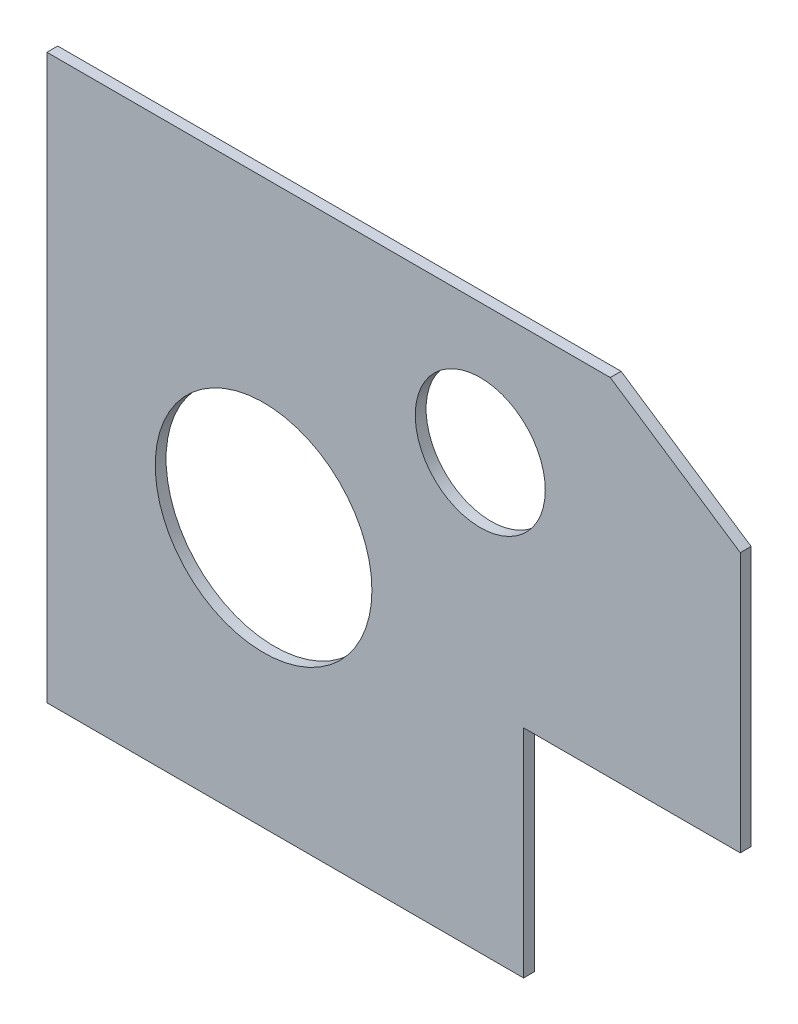
ISO-10303-21;
HEADER;
FILE_DESCRIPTION(('STEP AP214'),'2;1');
FILE_NAME('part.step','',(''),(''),'','','');
FILE_SCHEMA(('AUTOMOTIVE_DESIGN { 1 0 10303 214 1 1 1 1 }'));
ENDSEC;
DATA;
#1=APPLICATION_CONTEXT('core data for automotive mechanical design processes');
#2=APPLICATION_PROTOCOL_DEFINITION('international standard','automotive_design',2000,#1);
#3=PRODUCT_CONTEXT('',#1,'mechanical');
#4=PRODUCT('Part','Part','',(#3));
#5=PRODUCT_RELATED_PRODUCT_CATEGORY('part','',(#4));
#6=PRODUCT_DEFINITION_FORMATION('','',#4);
#7=PRODUCT_DEFINITION_CONTEXT('part definition',#1,'design');
#8=PRODUCT_DEFINITION('design','',#6,#7);
#9=PRODUCT_DEFINITION_SHAPE('','',#8);
#10=(LENGTH_UNIT() NAMED_UNIT(*) SI_UNIT(.MILLI.,.METRE.));
#11=(NAMED_UNIT(*) PLANE_ANGLE_UNIT() SI_UNIT($,.RADIAN.));
#12=(NAMED_UNIT(*) SI_UNIT($,.STERADIAN.) SOLID_ANGLE_UNIT());
#13=UNCERTAINTY_MEASURE_WITH_UNIT(LENGTH_MEASURE(1.E-05),#10,'distance_accuracy_value','');
#14=(GEOMETRIC_REPRESENTATION_CONTEXT(3) GLOBAL_UNCERTAINTY_ASSIGNED_CONTEXT((#13)) GLOBAL_UNIT_ASSIGNED_CONTEXT((#10,
#11,#12)) REPRESENTATION_CONTEXT('',''));
#15=CARTESIAN_POINT('',(0.,0.,0.));
#16=DIRECTION('',(0.,0.,1.));
#17=DIRECTION('',(1.,0.,0.));
#18=AXIS2_PLACEMENT_3D('',#15,#16,#17);
#19=CARTESIAN_POINT('',(203.2,0.,3.175));
#20=DIRECTION('',(-1.,0.,0.));
#21=DIRECTION('',(0.,0.,1.));
#22=AXIS2_PLACEMENT_3D('',#19,#20,#21);
#23=PLANE('',#22);
#24=DIRECTION('',(0.,0.,-1.));
#25=VECTOR('',#24,1.);
#26=CARTESIAN_POINT('',(203.2,139.7,334.439322230305));
#27=LINE('',#26,#25);
#28=CARTESIAN_POINT('',(203.2,139.7,3.17499999999998));
#29=VERTEX_POINT('',#28);
#30=CARTESIAN_POINT('',(203.2,139.7,0.));
#31=VERTEX_POINT('',#30);
#32=EDGE_CURVE('E48',#29,#31,#27,.T.);
#33=ORIENTED_EDGE('',*,*,#32,.F.);
#34=DIRECTION('',(0.,1.,0.));
#35=VECTOR('',#34,1.);
#36=CARTESIAN_POINT('',(203.2,0.,3.175));
#37=LINE('',#36,#35);
#38=CARTESIAN_POINT('',(203.2,63.5,3.175));
#39=VERTEX_POINT('',#38);
#40=EDGE_CURVE('E107',#39,#29,#37,.T.);
#41=ORIENTED_EDGE('',*,*,#40,.F.);
#42=DIRECTION('',(0.,0.,-1.));
#43=VECTOR('',#42,1.);
#44=CARTESIAN_POINT('',(203.2,63.5,3.176));
#45=LINE('',#44,#43);
#46=CARTESIAN_POINT('',(203.2,63.5,0.));
#47=VERTEX_POINT('',#46);
#48=EDGE_CURVE('E124',#39,#47,#45,.T.);
#49=ORIENTED_EDGE('',*,*,#48,.T.);
#50=DIRECTION('',(0.,1.,0.));
#51=VECTOR('',#50,1.);
#52=CARTESIAN_POINT('',(203.2,0.,0.));
#53=LINE('',#52,#51);
#54=EDGE_CURVE('E127',#47,#31,#53,.T.);
#55=ORIENTED_EDGE('',*,*,#54,.T.);
#56=EDGE_LOOP('',(#33,#41,#49,#55));
#57=FACE_BOUND('',#56,.T.);
#58=ADVANCED_FACE('F33',(#57),#23,.F.);
#59=CARTESIAN_POINT('',(0.,0.,3.175));
#60=DIRECTION('',(0.,0.,-1.));
#61=DIRECTION('',(-1.,0.,0.));
#62=AXIS2_PLACEMENT_3D('',#59,#60,#61);
#63=PLANE('',#62);
#64=CARTESIAN_POINT('',(127.,127.,3.175));
#65=DIRECTION('',(0.,0.,1.));
#66=DIRECTION('',(1.,0.,0.));
#67=AXIS2_PLACEMENT_3D('',#64,#65,#66);
#68=CIRCLE('',#67,19.05);
#69=CARTESIAN_POINT('',(146.05,127.,3.175));
#70=VERTEX_POINT('',#69);
#71=EDGE_CURVE('E166',#70,#70,#68,.T.);
#72=ORIENTED_EDGE('',*,*,#71,.F.);
#73=EDGE_LOOP('',(#72));
#74=FACE_BOUND('',#73,.T.);
#75=CARTESIAN_POINT('',(63.5,76.2,3.175));
#76=DIRECTION('',(0.,0.,1.));
#77=DIRECTION('',(1.,0.,0.));
#78=AXIS2_PLACEMENT_3D('',#75,#76,#77);
#79=CIRCLE('',#78,31.75);
#80=CARTESIAN_POINT('',(95.25,76.2,3.175));
#81=VERTEX_POINT('',#80);
#82=EDGE_CURVE('E160',#81,#81,#79,.T.);
#83=ORIENTED_EDGE('',*,*,#82,.F.);
#84=EDGE_LOOP('',(#83));
#85=FACE_BOUND('',#84,.T.);
#86=DIRECTION('',(0.832050294337844,-0.554700196225229,0.));
#87=VECTOR('',#86,1.);
#88=CARTESIAN_POINT('',(127.,190.5,3.175));
#89=LINE('',#88,#87);
#90=CARTESIAN_POINT('',(165.1,165.1,3.17499999999998));
#91=VERTEX_POINT('',#90);
#92=EDGE_CURVE('E93',#91,#29,#89,.T.);
#93=ORIENTED_EDGE('',*,*,#92,.F.);
#94=DIRECTION('',(-1.,0.,0.));
#95=VECTOR('',#94,1.);
#96=CARTESIAN_POINT('',(0.,165.1,3.175));
#97=LINE('',#96,#95);
#98=CARTESIAN_POINT('',(0.,165.1,3.175));
#99=VERTEX_POINT('',#98);
#100=EDGE_CURVE('E103',#91,#99,#97,.T.);
#101=ORIENTED_EDGE('',*,*,#100,.T.);
#102=DIRECTION('',(0.,-1.,0.));
#103=VECTOR('',#102,1.);
#104=CARTESIAN_POINT('',(0.,0.,3.175));
#105=LINE('',#104,#103);
#106=CARTESIAN_POINT('',(0.,0.,3.175));
#107=VERTEX_POINT('',#106);
#108=EDGE_CURVE('E131',#99,#107,#105,.T.);
#109=ORIENTED_EDGE('',*,*,#108,.T.);
#110=DIRECTION('',(1.,0.,0.));
#111=VECTOR('',#110,1.);
#112=CARTESIAN_POINT('',(0.,0.,3.175));
#113=LINE('',#112,#111);
#114=CARTESIAN_POINT('',(139.7,0.,3.175));
#115=VERTEX_POINT('',#114);
#116=EDGE_CURVE('E116',#107,#115,#113,.T.);
#117=ORIENTED_EDGE('',*,*,#116,.T.);
#118=DIRECTION('',(0.,-1.,0.));
#119=VECTOR('',#118,1.);
#120=CARTESIAN_POINT('',(139.7,0.,3.175));
#121=LINE('',#120,#119);
#122=CARTESIAN_POINT('',(139.7,63.5,3.175));
#123=VERTEX_POINT('',#122);
#124=EDGE_CURVE('E108',#123,#115,#121,.T.);
#125=ORIENTED_EDGE('',*,*,#124,.F.);
#126=DIRECTION('',(-1.,0.,0.));
#127=VECTOR('',#126,1.);
#128=CARTESIAN_POINT('',(203.2,63.5,3.175));
#129=LINE('',#128,#127);
#130=EDGE_CURVE('E145',#39,#123,#129,.T.);
#131=ORIENTED_EDGE('',*,*,#130,.F.);
#132=ORIENTED_EDGE('',*,*,#40,.T.);
#133=EDGE_LOOP('',(#93,#101,#109,#117,#125,#131,#132));
#134=FACE_BOUND('',#133,.T.);
#135=ADVANCED_FACE('F101',(#74,#85,#134),#63,.F.);
#136=CARTESIAN_POINT('',(0.,0.,0.));
#137=DIRECTION('',(0.,0.,-1.));
#138=DIRECTION('',(-1.,0.,0.));
#139=AXIS2_PLACEMENT_3D('',#136,#137,#138);
#140=PLANE('',#139);
#141=CARTESIAN_POINT('',(127.,127.,0.));
#142=DIRECTION('',(0.,0.,1.));
#143=DIRECTION('',(1.,0.,0.));
#144=AXIS2_PLACEMENT_3D('',#141,#142,#143);
#145=CIRCLE('',#144,19.05);
#146=CARTESIAN_POINT('',(146.05,127.,0.));
#147=VERTEX_POINT('',#146);
#148=EDGE_CURVE('E97',#147,#147,#145,.T.);
#149=ORIENTED_EDGE('',*,*,#148,.T.);
#150=EDGE_LOOP('',(#149));
#151=FACE_BOUND('',#150,.T.);
#152=CARTESIAN_POINT('',(63.5,76.2,0.));
#153=DIRECTION('',(0.,0.,1.));
#154=DIRECTION('',(1.,0.,0.));
#155=AXIS2_PLACEMENT_3D('',#152,#153,#154);
#156=CIRCLE('',#155,31.75);
#157=CARTESIAN_POINT('',(95.25,76.2,0.));
#158=VERTEX_POINT('',#157);
#159=EDGE_CURVE('E163',#158,#158,#156,.T.);
#160=ORIENTED_EDGE('',*,*,#159,.T.);
#161=EDGE_LOOP('',(#160));
#162=FACE_BOUND('',#161,.T.);
#163=DIRECTION('',(-1.,0.,0.));
#164=VECTOR('',#163,1.);
#165=CARTESIAN_POINT('',(0.,165.1,0.));
#166=LINE('',#165,#164);
#167=CARTESIAN_POINT('',(165.1,165.1,0.));
#168=VERTEX_POINT('',#167);
#169=CARTESIAN_POINT('',(0.,165.1,0.));
#170=VERTEX_POINT('',#169);
#171=EDGE_CURVE('E130',#168,#170,#166,.T.);
#172=ORIENTED_EDGE('',*,*,#171,.F.);
#173=DIRECTION('',(0.832050294337844,-0.554700196225229,0.));
#174=VECTOR('',#173,1.);
#175=CARTESIAN_POINT('',(127.,190.5,0.));
#176=LINE('',#175,#174);
#177=EDGE_CURVE('E11',#168,#31,#176,.T.);
#178=ORIENTED_EDGE('',*,*,#177,.T.);
#179=ORIENTED_EDGE('',*,*,#54,.F.);
#180=DIRECTION('',(1.,0.,0.));
#181=VECTOR('',#180,1.);
#182=CARTESIAN_POINT('',(203.2,63.5,0.));
#183=LINE('',#182,#181);
#184=CARTESIAN_POINT('',(139.7,63.5,0.));
#185=VERTEX_POINT('',#184);
#186=EDGE_CURVE('E144',#185,#47,#183,.T.);
#187=ORIENTED_EDGE('',*,*,#186,.F.);
#188=DIRECTION('',(0.,1.,0.));
#189=VECTOR('',#188,1.);
#190=CARTESIAN_POINT('',(139.7,0.,0.));
#191=LINE('',#190,#189);
#192=CARTESIAN_POINT('',(139.7,0.,0.));
#193=VERTEX_POINT('',#192);
#194=EDGE_CURVE('E142',#193,#185,#191,.T.);
#195=ORIENTED_EDGE('',*,*,#194,.F.);
#196=DIRECTION('',(1.,0.,0.));
#197=VECTOR('',#196,1.);
#198=CARTESIAN_POINT('',(0.,0.,0.));
#199=LINE('',#198,#197);
#200=CARTESIAN_POINT('',(0.,0.,0.));
#201=VERTEX_POINT('',#200);
#202=EDGE_CURVE('E123',#201,#193,#199,.T.);
#203=ORIENTED_EDGE('',*,*,#202,.F.);
#204=DIRECTION('',(0.,-1.,0.));
#205=VECTOR('',#204,1.);
#206=CARTESIAN_POINT('',(0.,0.,0.));
#207=LINE('',#206,#205);
#208=EDGE_CURVE('E120',#170,#201,#207,.T.);
#209=ORIENTED_EDGE('',*,*,#208,.F.);
#210=EDGE_LOOP('',(#172,#178,#179,#187,#195,#203,#209));
#211=FACE_BOUND('',#210,.T.);
#212=ADVANCED_FACE('F140',(#151,#162,#211),#140,.T.);
#213=CARTESIAN_POINT('',(0.,0.,3.175));
#214=DIRECTION('',(1.,0.,0.));
#215=DIRECTION('',(0.,0.,-1.));
#216=AXIS2_PLACEMENT_3D('',#213,#214,#215);
#217=PLANE('',#216);
#218=ORIENTED_EDGE('',*,*,#208,.T.);
#219=DIRECTION('',(0.,0.,-1.));
#220=VECTOR('',#219,1.);
#221=CARTESIAN_POINT('',(0.,0.,3.175));
#222=LINE('',#221,#220);
#223=EDGE_CURVE('E41',#107,#201,#222,.T.);
#224=ORIENTED_EDGE('',*,*,#223,.F.);
#225=ORIENTED_EDGE('',*,*,#108,.F.);
#226=DIRECTION('',(0.,0.,-1.));
#227=VECTOR('',#226,1.);
#228=CARTESIAN_POINT('',(0.,165.1,3.175));
#229=LINE('',#228,#227);
#230=EDGE_CURVE('E112',#99,#170,#229,.T.);
#231=ORIENTED_EDGE('',*,*,#230,.T.);
#232=EDGE_LOOP('',(#218,#224,#225,#231));
#233=FACE_BOUND('',#232,.T.);
#234=ADVANCED_FACE('F35',(#233),#217,.F.);
#235=CARTESIAN_POINT('',(0.,0.,3.175));
#236=DIRECTION('',(0.,1.,0.));
#237=DIRECTION('',(0.,0.,1.));
#238=AXIS2_PLACEMENT_3D('',#235,#236,#237);
#239=PLANE('',#238);
#240=ORIENTED_EDGE('',*,*,#202,.T.);
#241=DIRECTION('',(0.,0.,-1.));
#242=VECTOR('',#241,1.);
#243=CARTESIAN_POINT('',(139.7,0.,3.176));
#244=LINE('',#243,#242);
#245=EDGE_CURVE('E55',#115,#193,#244,.T.);
#246=ORIENTED_EDGE('',*,*,#245,.F.);
#247=ORIENTED_EDGE('',*,*,#116,.F.);
#248=ORIENTED_EDGE('',*,*,#223,.T.);
#249=EDGE_LOOP('',(#240,#246,#247,#248));
#250=FACE_BOUND('',#249,.T.);
#251=ADVANCED_FACE('F135',(#250),#239,.F.);
#252=CARTESIAN_POINT('',(0.,165.1,3.175));
#253=DIRECTION('',(0.,-1.,0.));
#254=DIRECTION('',(0.,0.,-1.));
#255=AXIS2_PLACEMENT_3D('',#252,#253,#254);
#256=PLANE('',#255);
#257=ORIENTED_EDGE('',*,*,#100,.F.);
#258=DIRECTION('',(0.,0.,-1.));
#259=VECTOR('',#258,1.);
#260=CARTESIAN_POINT('',(165.1,165.1,334.439322230305));
#261=LINE('',#260,#259);
#262=EDGE_CURVE('E90',#91,#168,#261,.T.);
#263=ORIENTED_EDGE('',*,*,#262,.T.);
#264=ORIENTED_EDGE('',*,*,#171,.T.);
#265=ORIENTED_EDGE('',*,*,#230,.F.);
#266=EDGE_LOOP('',(#257,#263,#264,#265));
#267=FACE_BOUND('',#266,.T.);
#268=ADVANCED_FACE('F110',(#267),#256,.F.);
#269=CARTESIAN_POINT('',(203.2,63.5,3.176));
#270=DIRECTION('',(0.,1.,0.));
#271=DIRECTION('',(0.,0.,1.));
#272=AXIS2_PLACEMENT_3D('',#269,#270,#271);
#273=PLANE('',#272);
#274=ORIENTED_EDGE('',*,*,#130,.T.);
#275=DIRECTION('',(0.,0.,-1.));
#276=VECTOR('',#275,1.);
#277=CARTESIAN_POINT('',(139.7,63.5,3.176));
#278=LINE('',#277,#276);
#279=EDGE_CURVE('E154',#123,#185,#278,.T.);
#280=ORIENTED_EDGE('',*,*,#279,.T.);
#281=ORIENTED_EDGE('',*,*,#186,.T.);
#282=ORIENTED_EDGE('',*,*,#48,.F.);
#283=EDGE_LOOP('',(#274,#280,#281,#282));
#284=FACE_BOUND('',#283,.T.);
#285=ADVANCED_FACE('F207',(#284),#273,.F.);
#286=CARTESIAN_POINT('',(139.7,0.,3.176));
#287=DIRECTION('',(-1.,0.,0.));
#288=DIRECTION('',(0.,0.,1.));
#289=AXIS2_PLACEMENT_3D('',#286,#287,#288);
#290=PLANE('',#289);
#291=ORIENTED_EDGE('',*,*,#124,.T.);
#292=ORIENTED_EDGE('',*,*,#245,.T.);
#293=ORIENTED_EDGE('',*,*,#194,.T.);
#294=ORIENTED_EDGE('',*,*,#279,.F.);
#295=EDGE_LOOP('',(#291,#292,#293,#294));
#296=FACE_BOUND('',#295,.T.);
#297=ADVANCED_FACE('F192',(#296),#290,.F.);
#298=CARTESIAN_POINT('',(165.1,165.1,334.439322230305));
#299=DIRECTION('',(0.554700196225229,0.832050294337844,0.));
#300=DIRECTION('',(-0.832050294337844,0.554700196225229,0.));
#301=AXIS2_PLACEMENT_3D('',#298,#299,#300);
#302=PLANE('',#301);
#303=ORIENTED_EDGE('',*,*,#262,.F.);
#304=ORIENTED_EDGE('',*,*,#92,.T.);
#305=ORIENTED_EDGE('',*,*,#32,.T.);
#306=ORIENTED_EDGE('',*,*,#177,.F.);
#307=EDGE_LOOP('',(#303,#304,#305,#306));
#308=FACE_BOUND('',#307,.T.);
#309=ADVANCED_FACE('F92',(#308),#302,.T.);
#310=CARTESIAN_POINT('',(63.5,76.2,0.));
#311=DIRECTION('',(0.,0.,1.));
#312=DIRECTION('',(1.,0.,0.));
#313=AXIS2_PLACEMENT_3D('',#310,#311,#312);
#314=CYLINDRICAL_SURFACE('',#313,31.75);
#315=ORIENTED_EDGE('',*,*,#159,.F.);
#316=EDGE_LOOP('',(#315));
#317=FACE_BOUND('',#316,.T.);
#318=ORIENTED_EDGE('',*,*,#82,.T.);
#319=EDGE_LOOP('',(#318));
#320=FACE_BOUND('',#319,.T.);
#321=ADVANCED_FACE('F177',(#317,#320),#314,.F.);
#322=CARTESIAN_POINT('',(127.,127.,0.));
#323=DIRECTION('',(0.,0.,1.));
#324=DIRECTION('',(1.,0.,0.));
#325=AXIS2_PLACEMENT_3D('',#322,#323,#324);
#326=CYLINDRICAL_SURFACE('',#325,19.05);
#327=ORIENTED_EDGE('',*,*,#148,.F.);
#328=EDGE_LOOP('',(#327));
#329=FACE_BOUND('',#328,.T.);
#330=ORIENTED_EDGE('',*,*,#71,.T.);
#331=EDGE_LOOP('',(#330));
#332=FACE_BOUND('',#331,.T.);
#333=ADVANCED_FACE('F174',(#329,#332),#326,.F.);
#334=CLOSED_SHELL('',(#58,#135,#212,#234,#251,#268,#285,#297,#309,#321,#333));
#335=MANIFOLD_SOLID_BREP('B2',#334);
#336=ADVANCED_BREP_SHAPE_REPRESENTATION('',(#18,#335),#14);
#337=SHAPE_DEFINITION_REPRESENTATION(#9,#336);
ENDSEC;
END-ISO-10303-21;
